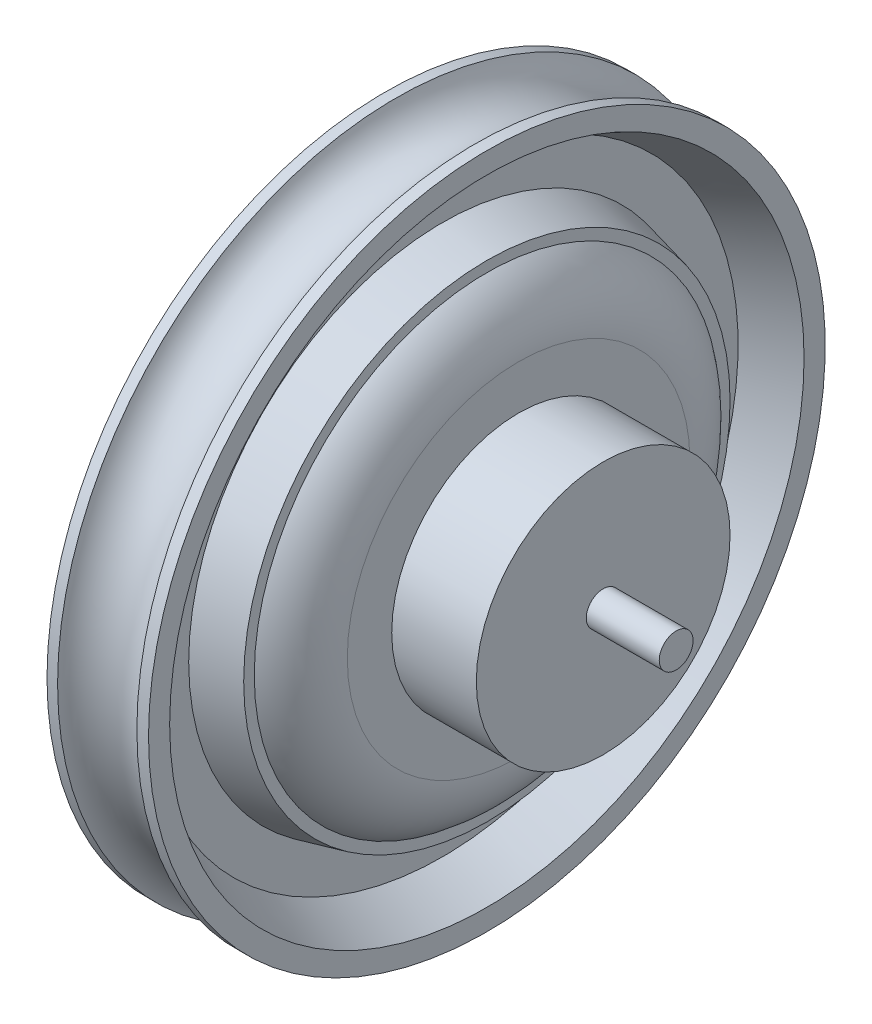
ISO-10303-21;
HEADER;
FILE_DESCRIPTION(('STEP AP214'),'2;1');
FILE_NAME('part.step','',(''),(''),'','','');
FILE_SCHEMA(('AUTOMOTIVE_DESIGN { 1 0 10303 214 1 1 1 1 }'));
ENDSEC;
DATA;
#1=APPLICATION_CONTEXT('core data for automotive mechanical design processes');
#2=APPLICATION_PROTOCOL_DEFINITION('international standard','automotive_design',2000,#1);
#3=PRODUCT_CONTEXT('',#1,'mechanical');
#4=PRODUCT('Part','Part','',(#3));
#5=PRODUCT_RELATED_PRODUCT_CATEGORY('part','',(#4));
#6=PRODUCT_DEFINITION_FORMATION('','',#4);
#7=PRODUCT_DEFINITION_CONTEXT('part definition',#1,'design');
#8=PRODUCT_DEFINITION('design','',#6,#7);
#9=PRODUCT_DEFINITION_SHAPE('','',#8);
#10=(LENGTH_UNIT() NAMED_UNIT(*) SI_UNIT(.MILLI.,.METRE.));
#11=(NAMED_UNIT(*) PLANE_ANGLE_UNIT() SI_UNIT($,.RADIAN.));
#12=(NAMED_UNIT(*) SI_UNIT($,.STERADIAN.) SOLID_ANGLE_UNIT());
#13=UNCERTAINTY_MEASURE_WITH_UNIT(LENGTH_MEASURE(1.E-05),#10,'distance_accuracy_value','');
#14=(GEOMETRIC_REPRESENTATION_CONTEXT(3) GLOBAL_UNCERTAINTY_ASSIGNED_CONTEXT((#13)) GLOBAL_UNIT_ASSIGNED_CONTEXT((#10,
#11,#12)) REPRESENTATION_CONTEXT('',''));
#15=CARTESIAN_POINT('',(0.,0.,0.));
#16=DIRECTION('',(0.,0.,1.));
#17=DIRECTION('',(1.,0.,0.));
#18=AXIS2_PLACEMENT_3D('',#15,#16,#17);
#19=CARTESIAN_POINT('',(-34.6658042744657,0.,-30.4980877390326));
#20=DIRECTION('',(-1.,0.,0.));
#21=DIRECTION('',(0.,0.,1.));
#22=AXIS2_PLACEMENT_3D('',#19,#20,#21);
#23=CYLINDRICAL_SURFACE('',#22,160.);
#24=CARTESIAN_POINT('',(41.1341957255343,0.,-30.4980877390326));
#25=DIRECTION('',(-1.,0.,0.));
#26=DIRECTION('',(0.,0.,1.));
#27=AXIS2_PLACEMENT_3D('',#24,#25,#26);
#28=CIRCLE('',#27,160.);
#29=CARTESIAN_POINT('',(41.1341957255343,0.,129.501912260967));
#30=VERTEX_POINT('',#29);
#31=EDGE_CURVE('E8',#30,#30,#28,.T.);
#32=ORIENTED_EDGE('',*,*,#31,.T.);
#33=EDGE_LOOP('',(#32));
#34=FACE_BOUND('',#33,.T.);
#35=CARTESIAN_POINT('',(36.1341957255343,0.,-30.4980877390326));
#36=DIRECTION('',(-1.,0.,0.));
#37=DIRECTION('',(0.,0.,1.));
#38=AXIS2_PLACEMENT_3D('',#35,#36,#37);
#39=CIRCLE('',#38,160.);
#40=CARTESIAN_POINT('',(36.1341957255343,0.,129.501912260967));
#41=VERTEX_POINT('',#40);
#42=EDGE_CURVE('E89',#41,#41,#39,.T.);
#43=ORIENTED_EDGE('',*,*,#42,.F.);
#44=EDGE_LOOP('',(#43));
#45=FACE_BOUND('',#44,.T.);
#46=ADVANCED_FACE('F13',(#34,#45),#23,.T.);
#47=CARTESIAN_POINT('',(59.8801501722441,0.,-30.4980877390326));
#48=DIRECTION('',(-1.,0.,0.));
#49=DIRECTION('',(0.,0.,1.));
#50=AXIS2_PLACEMENT_3D('',#47,#48,#49);
#51=TOROIDAL_SURFACE('',#50,166.614485433809,19.8786877251038);
#52=CARTESIAN_POINT('',(78.6261046189538,0.,-30.4980877390326));
#53=DIRECTION('',(-1.,0.,0.));
#54=DIRECTION('',(0.,0.,1.));
#55=AXIS2_PLACEMENT_3D('',#52,#53,#54);
#56=CIRCLE('',#55,160.);
#57=CARTESIAN_POINT('',(78.6261046189538,0.,129.501912260967));
#58=VERTEX_POINT('',#57);
#59=EDGE_CURVE('E19',#58,#58,#56,.T.);
#60=ORIENTED_EDGE('',*,*,#59,.T.);
#61=EDGE_LOOP('',(#60));
#62=FACE_BOUND('',#61,.T.);
#63=ORIENTED_EDGE('',*,*,#31,.F.);
#64=EDGE_LOOP('',(#63));
#65=FACE_BOUND('',#64,.T.);
#66=ADVANCED_FACE('F97',(#62,#65),#51,.F.);
#67=CARTESIAN_POINT('',(-34.6658042744657,0.,-30.4980877390326));
#68=DIRECTION('',(-1.,0.,0.));
#69=DIRECTION('',(0.,0.,1.));
#70=AXIS2_PLACEMENT_3D('',#67,#68,#69);
#71=CYLINDRICAL_SURFACE('',#70,160.);
#72=CARTESIAN_POINT('',(84.1341957255343,0.,-30.4980877390326));
#73=DIRECTION('',(-1.,0.,0.));
#74=DIRECTION('',(0.,0.,1.));
#75=AXIS2_PLACEMENT_3D('',#72,#73,#74);
#76=CIRCLE('',#75,160.);
#77=CARTESIAN_POINT('',(84.1341957255343,0.,129.501912260967));
#78=VERTEX_POINT('',#77);
#79=EDGE_CURVE('E23',#78,#78,#76,.T.);
#80=ORIENTED_EDGE('',*,*,#79,.T.);
#81=EDGE_LOOP('',(#80));
#82=FACE_BOUND('',#81,.T.);
#83=ORIENTED_EDGE('',*,*,#59,.F.);
#84=EDGE_LOOP('',(#83));
#85=FACE_BOUND('',#84,.T.);
#86=ADVANCED_FACE('F102',(#82,#85),#71,.T.);
#87=CARTESIAN_POINT('',(84.1341957255343,0.,129.501912260967));
#88=DIRECTION('',(1.,0.,0.));
#89=DIRECTION('',(0.,0.,-1.));
#90=AXIS2_PLACEMENT_3D('',#87,#88,#89);
#91=PLANE('',#90);
#92=CARTESIAN_POINT('',(84.1341957255343,0.,-30.4980877390326));
#93=DIRECTION('',(-1.,0.,0.));
#94=DIRECTION('',(0.,0.,1.));
#95=AXIS2_PLACEMENT_3D('',#92,#93,#94);
#96=CIRCLE('',#95,150.);
#97=CARTESIAN_POINT('',(84.1341957255343,0.,119.501912260967));
#98=VERTEX_POINT('',#97);
#99=EDGE_CURVE('E27',#98,#98,#96,.T.);
#100=ORIENTED_EDGE('',*,*,#99,.T.);
#101=EDGE_LOOP('',(#100));
#102=FACE_BOUND('',#101,.T.);
#103=ORIENTED_EDGE('',*,*,#79,.F.);
#104=EDGE_LOOP('',(#103));
#105=FACE_BOUND('',#104,.T.);
#106=ADVANCED_FACE('F106',(#102,#105),#91,.T.);
#107=CARTESIAN_POINT('',(84.1341957255343,0.,-30.4980877390326));
#108=DIRECTION('',(1.,0.,0.));
#109=DIRECTION('',(0.,0.,-1.));
#110=AXIS2_PLACEMENT_3D('',#107,#108,#109);
#111=CONICAL_SURFACE('',#110,150.,0.451502029192342);
#112=CARTESIAN_POINT('',(63.1341957255343,0.,-30.4980877390326));
#113=DIRECTION('',(-1.,0.,0.));
#114=DIRECTION('',(0.,0.,1.));
#115=AXIS2_PLACEMENT_3D('',#112,#113,#114);
#116=CIRCLE('',#115,139.816912510161);
#117=CARTESIAN_POINT('',(63.1341957255343,0.,109.318824771128));
#118=VERTEX_POINT('',#117);
#119=EDGE_CURVE('E32',#118,#118,#116,.T.);
#120=ORIENTED_EDGE('',*,*,#119,.T.);
#121=EDGE_LOOP('',(#120));
#122=FACE_BOUND('',#121,.T.);
#123=ORIENTED_EDGE('',*,*,#99,.F.);
#124=EDGE_LOOP('',(#123));
#125=FACE_BOUND('',#124,.T.);
#126=ADVANCED_FACE('F113',(#122,#125),#111,.F.);
#127=CARTESIAN_POINT('',(63.1341957255343,0.,89.5019122609674));
#128=DIRECTION('',(1.,0.,0.));
#129=DIRECTION('',(0.,0.,-1.));
#130=AXIS2_PLACEMENT_3D('',#127,#128,#129);
#131=PLANE('',#130);
#132=CARTESIAN_POINT('',(63.1341957255343,0.,-30.4980877390326));
#133=DIRECTION('',(-1.,0.,0.));
#134=DIRECTION('',(0.,0.,1.));
#135=AXIS2_PLACEMENT_3D('',#132,#133,#134);
#136=CIRCLE('',#135,120.);
#137=CARTESIAN_POINT('',(63.1341957255343,0.,89.5019122609674));
#138=VERTEX_POINT('',#137);
#139=EDGE_CURVE('E35',#138,#138,#136,.T.);
#140=ORIENTED_EDGE('',*,*,#139,.T.);
#141=EDGE_LOOP('',(#140));
#142=FACE_BOUND('',#141,.T.);
#143=ORIENTED_EDGE('',*,*,#119,.F.);
#144=EDGE_LOOP('',(#143));
#145=FACE_BOUND('',#144,.T.);
#146=ADVANCED_FACE('F117',(#142,#145),#131,.T.);
#147=CARTESIAN_POINT('',(63.1341957255343,0.,-30.4980877390326));
#148=DIRECTION('',(-1.,0.,0.));
#149=DIRECTION('',(0.,0.,1.));
#150=AXIS2_PLACEMENT_3D('',#147,#148,#149);
#151=CONICAL_SURFACE('',#150,120.,0.233743180868901);
#152=CARTESIAN_POINT('',(84.1341957255343,0.,-30.4980877390326));
#153=DIRECTION('',(-1.,0.,0.));
#154=DIRECTION('',(0.,0.,1.));
#155=AXIS2_PLACEMENT_3D('',#152,#153,#154);
#156=CIRCLE('',#155,115.);
#157=CARTESIAN_POINT('',(84.1341957255343,0.,84.5019122609674));
#158=VERTEX_POINT('',#157);
#159=EDGE_CURVE('E38',#158,#158,#156,.T.);
#160=ORIENTED_EDGE('',*,*,#159,.T.);
#161=EDGE_LOOP('',(#160));
#162=FACE_BOUND('',#161,.T.);
#163=ORIENTED_EDGE('',*,*,#139,.F.);
#164=EDGE_LOOP('',(#163));
#165=FACE_BOUND('',#164,.T.);
#166=ADVANCED_FACE('F121',(#162,#165),#151,.T.);
#167=CARTESIAN_POINT('',(84.1341957255343,0.,84.5019122609674));
#168=DIRECTION('',(1.,0.,0.));
#169=DIRECTION('',(0.,0.,-1.));
#170=AXIS2_PLACEMENT_3D('',#167,#168,#169);
#171=PLANE('',#170);
#172=CARTESIAN_POINT('',(84.1341957255343,0.,-30.4980877390326));
#173=DIRECTION('',(-1.,0.,0.));
#174=DIRECTION('',(0.,0.,1.));
#175=AXIS2_PLACEMENT_3D('',#172,#173,#174);
#176=CIRCLE('',#175,110.);
#177=CARTESIAN_POINT('',(84.1341957255343,0.,79.5019122609674));
#178=VERTEX_POINT('',#177);
#179=EDGE_CURVE('E41',#178,#178,#176,.T.);
#180=ORIENTED_EDGE('',*,*,#179,.T.);
#181=EDGE_LOOP('',(#180));
#182=FACE_BOUND('',#181,.T.);
#183=ORIENTED_EDGE('',*,*,#159,.F.);
#184=EDGE_LOOP('',(#183));
#185=FACE_BOUND('',#184,.T.);
#186=ADVANCED_FACE('F125',(#182,#185),#171,.T.);
#187=CARTESIAN_POINT('',(63.6008623922011,0.,-30.4980877390326));
#188=DIRECTION('',(-1.,0.,0.));
#189=DIRECTION('',(0.,0.,1.));
#190=AXIS2_PLACEMENT_3D('',#187,#188,#189);
#191=TOROIDAL_SURFACE('',#190,81.,35.5333333333333);
#192=CARTESIAN_POINT('',(99.1341957255343,0.,-30.4980877390326));
#193=DIRECTION('',(-1.,0.,0.));
#194=DIRECTION('',(0.,0.,1.));
#195=AXIS2_PLACEMENT_3D('',#192,#193,#194);
#196=CIRCLE('',#195,81.);
#197=CARTESIAN_POINT('',(99.1341957255343,0.,50.5019122609674));
#198=VERTEX_POINT('',#197);
#199=EDGE_CURVE('E44',#198,#198,#196,.T.);
#200=ORIENTED_EDGE('',*,*,#199,.T.);
#201=EDGE_LOOP('',(#200));
#202=FACE_BOUND('',#201,.T.);
#203=ORIENTED_EDGE('',*,*,#179,.F.);
#204=EDGE_LOOP('',(#203));
#205=FACE_BOUND('',#204,.T.);
#206=ADVANCED_FACE('F129',(#202,#205),#191,.T.);
#207=CARTESIAN_POINT('',(99.1341957255343,0.,29.5019122609674));
#208=DIRECTION('',(1.,0.,0.));
#209=DIRECTION('',(0.,0.,-1.));
#210=AXIS2_PLACEMENT_3D('',#207,#208,#209);
#211=PLANE('',#210);
#212=CARTESIAN_POINT('',(99.1341957255343,0.,-30.4980877390326));
#213=DIRECTION('',(-1.,0.,0.));
#214=DIRECTION('',(0.,0.,1.));
#215=AXIS2_PLACEMENT_3D('',#212,#213,#214);
#216=CIRCLE('',#215,60.);
#217=CARTESIAN_POINT('',(99.1341957255343,0.,29.5019122609674));
#218=VERTEX_POINT('',#217);
#219=EDGE_CURVE('E47',#218,#218,#216,.T.);
#220=ORIENTED_EDGE('',*,*,#219,.T.);
#221=EDGE_LOOP('',(#220));
#222=FACE_BOUND('',#221,.T.);
#223=ORIENTED_EDGE('',*,*,#199,.F.);
#224=EDGE_LOOP('',(#223));
#225=FACE_BOUND('',#224,.T.);
#226=ADVANCED_FACE('F133',(#222,#225),#211,.T.);
#227=CARTESIAN_POINT('',(-34.6658042744657,0.,-30.4980877390326));
#228=DIRECTION('',(-1.,0.,0.));
#229=DIRECTION('',(0.,0.,1.));
#230=AXIS2_PLACEMENT_3D('',#227,#228,#229);
#231=CYLINDRICAL_SURFACE('',#230,60.);
#232=CARTESIAN_POINT('',(139.134195725534,0.,-30.4980877390326));
#233=DIRECTION('',(-1.,0.,0.));
#234=DIRECTION('',(0.,0.,1.));
#235=AXIS2_PLACEMENT_3D('',#232,#233,#234);
#236=CIRCLE('',#235,60.);
#237=CARTESIAN_POINT('',(139.134195725534,0.,29.5019122609674));
#238=VERTEX_POINT('',#237);
#239=EDGE_CURVE('E50',#238,#238,#236,.T.);
#240=ORIENTED_EDGE('',*,*,#239,.T.);
#241=EDGE_LOOP('',(#240));
#242=FACE_BOUND('',#241,.T.);
#243=ORIENTED_EDGE('',*,*,#219,.F.);
#244=EDGE_LOOP('',(#243));
#245=FACE_BOUND('',#244,.T.);
#246=ADVANCED_FACE('F137',(#242,#245),#231,.T.);
#247=CARTESIAN_POINT('',(139.134195725534,0.,29.5019122609674));
#248=DIRECTION('',(1.,0.,0.));
#249=DIRECTION('',(0.,0.,-1.));
#250=AXIS2_PLACEMENT_3D('',#247,#248,#249);
#251=PLANE('',#250);
#252=CARTESIAN_POINT('',(139.134195725534,0.,-30.4980877390326));
#253=DIRECTION('',(-1.,0.,0.));
#254=DIRECTION('',(0.,0.,1.));
#255=AXIS2_PLACEMENT_3D('',#252,#253,#254);
#256=CIRCLE('',#255,8.00000000000001);
#257=CARTESIAN_POINT('',(139.134195725534,0.,-22.4980877390326));
#258=VERTEX_POINT('',#257);
#259=EDGE_CURVE('E53',#258,#258,#256,.T.);
#260=ORIENTED_EDGE('',*,*,#259,.T.);
#261=EDGE_LOOP('',(#260));
#262=FACE_BOUND('',#261,.T.);
#263=ORIENTED_EDGE('',*,*,#239,.F.);
#264=EDGE_LOOP('',(#263));
#265=FACE_BOUND('',#264,.T.);
#266=ADVANCED_FACE('F141',(#262,#265),#251,.T.);
#267=CARTESIAN_POINT('',(-34.6658042744657,0.,-30.4980877390326));
#268=DIRECTION('',(-1.,0.,0.));
#269=DIRECTION('',(0.,0.,1.));
#270=AXIS2_PLACEMENT_3D('',#267,#268,#269);
#271=CYLINDRICAL_SURFACE('',#270,8.);
#272=CARTESIAN_POINT('',(173.634195725534,0.,-30.4980877390326));
#273=DIRECTION('',(-1.,0.,0.));
#274=DIRECTION('',(0.,0.,1.));
#275=AXIS2_PLACEMENT_3D('',#272,#273,#274);
#276=CIRCLE('',#275,8.);
#277=CARTESIAN_POINT('',(173.634195725534,0.,-22.4980877390326));
#278=VERTEX_POINT('',#277);
#279=EDGE_CURVE('E56',#278,#278,#276,.T.);
#280=ORIENTED_EDGE('',*,*,#279,.T.);
#281=EDGE_LOOP('',(#280));
#282=FACE_BOUND('',#281,.T.);
#283=ORIENTED_EDGE('',*,*,#259,.F.);
#284=EDGE_LOOP('',(#283));
#285=FACE_BOUND('',#284,.T.);
#286=ADVANCED_FACE('F145',(#282,#285),#271,.T.);
#287=CARTESIAN_POINT('',(173.634195725534,0.,-30.4980877390326));
#288=DIRECTION('',(1.,0.,0.));
#289=DIRECTION('',(0.,0.,-1.));
#290=AXIS2_PLACEMENT_3D('',#287,#288,#289);
#291=PLANE('',#290);
#292=ORIENTED_EDGE('',*,*,#279,.F.);
#293=EDGE_LOOP('',(#292));
#294=FACE_BOUND('',#293,.T.);
#295=ADVANCED_FACE('F149',(#294),#291,.T.);
#296=CARTESIAN_POINT('',(-53.3658042744657,0.,-30.4980877390326));
#297=DIRECTION('',(-1.,0.,0.));
#298=DIRECTION('',(0.,0.,1.));
#299=AXIS2_PLACEMENT_3D('',#296,#297,#298);
#300=PLANE('',#299);
#301=CARTESIAN_POINT('',(-53.3658042744657,0.,-30.4980877390326));
#302=DIRECTION('',(-1.,0.,0.));
#303=DIRECTION('',(0.,0.,1.));
#304=AXIS2_PLACEMENT_3D('',#301,#302,#303);
#305=CIRCLE('',#304,8.);
#306=CARTESIAN_POINT('',(-53.3658042744657,0.,-22.4980877390326));
#307=VERTEX_POINT('',#306);
#308=EDGE_CURVE('E59',#307,#307,#305,.T.);
#309=ORIENTED_EDGE('',*,*,#308,.T.);
#310=EDGE_LOOP('',(#309));
#311=FACE_BOUND('',#310,.T.);
#312=ADVANCED_FACE('F153',(#311),#300,.T.);
#313=CARTESIAN_POINT('',(-34.6658042744657,0.,-30.4980877390326));
#314=DIRECTION('',(-1.,0.,0.));
#315=DIRECTION('',(0.,0.,1.));
#316=AXIS2_PLACEMENT_3D('',#313,#314,#315);
#317=CYLINDRICAL_SURFACE('',#316,8.);
#318=CARTESIAN_POINT('',(-18.8658042744657,0.,-30.4980877390326));
#319=DIRECTION('',(-1.,0.,0.));
#320=DIRECTION('',(0.,0.,1.));
#321=AXIS2_PLACEMENT_3D('',#318,#319,#320);
#322=CIRCLE('',#321,8.);
#323=CARTESIAN_POINT('',(-18.8658042744657,0.,-22.4980877390326));
#324=VERTEX_POINT('',#323);
#325=EDGE_CURVE('E62',#324,#324,#322,.T.);
#326=ORIENTED_EDGE('',*,*,#325,.T.);
#327=EDGE_LOOP('',(#326));
#328=FACE_BOUND('',#327,.T.);
#329=ORIENTED_EDGE('',*,*,#308,.F.);
#330=EDGE_LOOP('',(#329));
#331=FACE_BOUND('',#330,.T.);
#332=ADVANCED_FACE('F157',(#328,#331),#317,.T.);
#333=CARTESIAN_POINT('',(-18.8658042744657,0.,-22.4980877390326));
#334=DIRECTION('',(-1.,0.,0.));
#335=DIRECTION('',(0.,0.,1.));
#336=AXIS2_PLACEMENT_3D('',#333,#334,#335);
#337=PLANE('',#336);
#338=CARTESIAN_POINT('',(-18.8658042744657,0.,-30.4980877390326));
#339=DIRECTION('',(-1.,0.,0.));
#340=DIRECTION('',(0.,0.,1.));
#341=AXIS2_PLACEMENT_3D('',#338,#339,#340);
#342=CIRCLE('',#341,20.);
#343=CARTESIAN_POINT('',(-18.8658042744657,0.,-10.4980877390326));
#344=VERTEX_POINT('',#343);
#345=EDGE_CURVE('E65',#344,#344,#342,.T.);
#346=ORIENTED_EDGE('',*,*,#345,.T.);
#347=EDGE_LOOP('',(#346));
#348=FACE_BOUND('',#347,.T.);
#349=ORIENTED_EDGE('',*,*,#325,.F.);
#350=EDGE_LOOP('',(#349));
#351=FACE_BOUND('',#350,.T.);
#352=ADVANCED_FACE('F161',(#348,#351),#337,.T.);
#353=CARTESIAN_POINT('',(-34.6658042744657,0.,-30.4980877390326));
#354=DIRECTION('',(-1.,0.,0.));
#355=DIRECTION('',(0.,0.,1.));
#356=AXIS2_PLACEMENT_3D('',#353,#354,#355);
#357=CYLINDRICAL_SURFACE('',#356,20.);
#358=CARTESIAN_POINT('',(21.1341957255343,0.,-30.4980877390326));
#359=DIRECTION('',(-1.,0.,0.));
#360=DIRECTION('',(0.,0.,1.));
#361=AXIS2_PLACEMENT_3D('',#358,#359,#360);
#362=CIRCLE('',#361,20.);
#363=CARTESIAN_POINT('',(21.1341957255343,0.,-10.4980877390326));
#364=VERTEX_POINT('',#363);
#365=EDGE_CURVE('E68',#364,#364,#362,.T.);
#366=ORIENTED_EDGE('',*,*,#365,.T.);
#367=EDGE_LOOP('',(#366));
#368=FACE_BOUND('',#367,.T.);
#369=ORIENTED_EDGE('',*,*,#345,.F.);
#370=EDGE_LOOP('',(#369));
#371=FACE_BOUND('',#370,.T.);
#372=ADVANCED_FACE('F165',(#368,#371),#357,.T.);
#373=CARTESIAN_POINT('',(21.1341957255343,0.,-10.4980877390326));
#374=DIRECTION('',(-1.,0.,0.));
#375=DIRECTION('',(0.,0.,1.));
#376=AXIS2_PLACEMENT_3D('',#373,#374,#375);
#377=PLANE('',#376);
#378=CARTESIAN_POINT('',(21.1341957255343,0.,-30.4980877390326));
#379=DIRECTION('',(-1.,0.,0.));
#380=DIRECTION('',(0.,0.,1.));
#381=AXIS2_PLACEMENT_3D('',#378,#379,#380);
#382=CIRCLE('',#381,81.);
#383=CARTESIAN_POINT('',(21.1341957255343,0.,50.5019122609674));
#384=VERTEX_POINT('',#383);
#385=EDGE_CURVE('E71',#384,#384,#382,.T.);
#386=ORIENTED_EDGE('',*,*,#385,.T.);
#387=EDGE_LOOP('',(#386));
#388=FACE_BOUND('',#387,.T.);
#389=ORIENTED_EDGE('',*,*,#365,.F.);
#390=EDGE_LOOP('',(#389));
#391=FACE_BOUND('',#390,.T.);
#392=ADVANCED_FACE('F169',(#388,#391),#377,.T.);
#393=CARTESIAN_POINT('',(56.6675290588677,0.,-30.4980877390326));
#394=DIRECTION('',(-1.,0.,0.));
#395=DIRECTION('',(0.,0.,1.));
#396=AXIS2_PLACEMENT_3D('',#393,#394,#395);
#397=TOROIDAL_SURFACE('',#396,81.,35.5333333333333);
#398=CARTESIAN_POINT('',(36.1341957255343,0.,-30.4980877390326));
#399=DIRECTION('',(-1.,0.,0.));
#400=DIRECTION('',(0.,0.,1.));
#401=AXIS2_PLACEMENT_3D('',#398,#399,#400);
#402=CIRCLE('',#401,110.);
#403=CARTESIAN_POINT('',(36.1341957255343,0.,79.5019122609674));
#404=VERTEX_POINT('',#403);
#405=EDGE_CURVE('E74',#404,#404,#402,.T.);
#406=ORIENTED_EDGE('',*,*,#405,.T.);
#407=EDGE_LOOP('',(#406));
#408=FACE_BOUND('',#407,.T.);
#409=ORIENTED_EDGE('',*,*,#385,.F.);
#410=EDGE_LOOP('',(#409));
#411=FACE_BOUND('',#410,.T.);
#412=ADVANCED_FACE('F173',(#408,#411),#397,.T.);
#413=CARTESIAN_POINT('',(36.1341957255343,0.,84.5019122609674));
#414=DIRECTION('',(-1.,0.,0.));
#415=DIRECTION('',(0.,0.,1.));
#416=AXIS2_PLACEMENT_3D('',#413,#414,#415);
#417=PLANE('',#416);
#418=CARTESIAN_POINT('',(36.1341957255343,0.,-30.4980877390326));
#419=DIRECTION('',(-1.,0.,0.));
#420=DIRECTION('',(0.,0.,1.));
#421=AXIS2_PLACEMENT_3D('',#418,#419,#420);
#422=CIRCLE('',#421,115.);
#423=CARTESIAN_POINT('',(36.1341957255343,0.,84.5019122609674));
#424=VERTEX_POINT('',#423);
#425=EDGE_CURVE('E77',#424,#424,#422,.T.);
#426=ORIENTED_EDGE('',*,*,#425,.T.);
#427=EDGE_LOOP('',(#426));
#428=FACE_BOUND('',#427,.T.);
#429=ORIENTED_EDGE('',*,*,#405,.F.);
#430=EDGE_LOOP('',(#429));
#431=FACE_BOUND('',#430,.T.);
#432=ADVANCED_FACE('F177',(#428,#431),#417,.T.);
#433=CARTESIAN_POINT('',(36.1341957255343,0.,-30.4980877390326));
#434=DIRECTION('',(1.,0.,0.));
#435=DIRECTION('',(0.,0.,-1.));
#436=AXIS2_PLACEMENT_3D('',#433,#434,#435);
#437=CONICAL_SURFACE('',#436,115.,0.233743180868902);
#438=CARTESIAN_POINT('',(57.1341957255343,0.,-30.4980877390326));
#439=DIRECTION('',(-1.,0.,0.));
#440=DIRECTION('',(0.,0.,1.));
#441=AXIS2_PLACEMENT_3D('',#438,#439,#440);
#442=CIRCLE('',#441,120.);
#443=CARTESIAN_POINT('',(57.1341957255343,0.,89.5019122609674));
#444=VERTEX_POINT('',#443);
#445=EDGE_CURVE('E80',#444,#444,#442,.T.);
#446=ORIENTED_EDGE('',*,*,#445,.T.);
#447=EDGE_LOOP('',(#446));
#448=FACE_BOUND('',#447,.T.);
#449=ORIENTED_EDGE('',*,*,#425,.F.);
#450=EDGE_LOOP('',(#449));
#451=FACE_BOUND('',#450,.T.);
#452=ADVANCED_FACE('F181',(#448,#451),#437,.T.);
#453=CARTESIAN_POINT('',(57.1341957255343,0.,89.5019122609674));
#454=DIRECTION('',(-1.,0.,0.));
#455=DIRECTION('',(0.,0.,1.));
#456=AXIS2_PLACEMENT_3D('',#453,#454,#455);
#457=PLANE('',#456);
#458=CARTESIAN_POINT('',(57.1341957255343,0.,-30.4980877390326));
#459=DIRECTION('',(-1.,0.,0.));
#460=DIRECTION('',(0.,0.,1.));
#461=AXIS2_PLACEMENT_3D('',#458,#459,#460);
#462=CIRCLE('',#461,139.816912510161);
#463=CARTESIAN_POINT('',(57.1341957255343,0.,109.318824771128));
#464=VERTEX_POINT('',#463);
#465=EDGE_CURVE('E83',#464,#464,#462,.T.);
#466=ORIENTED_EDGE('',*,*,#465,.T.);
#467=EDGE_LOOP('',(#466));
#468=FACE_BOUND('',#467,.T.);
#469=ORIENTED_EDGE('',*,*,#445,.F.);
#470=EDGE_LOOP('',(#469));
#471=FACE_BOUND('',#470,.T.);
#472=ADVANCED_FACE('F185',(#468,#471),#457,.T.);
#473=CARTESIAN_POINT('',(57.1341957255343,0.,-30.4980877390326));
#474=DIRECTION('',(-1.,0.,0.));
#475=DIRECTION('',(0.,0.,1.));
#476=AXIS2_PLACEMENT_3D('',#473,#474,#475);
#477=CONICAL_SURFACE('',#476,139.816912510161,0.451502029192342);
#478=CARTESIAN_POINT('',(36.1341957255343,0.,-30.4980877390326));
#479=DIRECTION('',(-1.,0.,0.));
#480=DIRECTION('',(0.,0.,1.));
#481=AXIS2_PLACEMENT_3D('',#478,#479,#480);
#482=CIRCLE('',#481,150.);
#483=CARTESIAN_POINT('',(36.1341957255343,0.,119.501912260967));
#484=VERTEX_POINT('',#483);
#485=EDGE_CURVE('E86',#484,#484,#482,.T.);
#486=ORIENTED_EDGE('',*,*,#485,.T.);
#487=EDGE_LOOP('',(#486));
#488=FACE_BOUND('',#487,.T.);
#489=ORIENTED_EDGE('',*,*,#465,.F.);
#490=EDGE_LOOP('',(#489));
#491=FACE_BOUND('',#490,.T.);
#492=ADVANCED_FACE('F189',(#488,#491),#477,.F.);
#493=CARTESIAN_POINT('',(36.1341957255343,0.,129.501912260967));
#494=DIRECTION('',(-1.,0.,0.));
#495=DIRECTION('',(0.,0.,1.));
#496=AXIS2_PLACEMENT_3D('',#493,#494,#495);
#497=PLANE('',#496);
#498=ORIENTED_EDGE('',*,*,#42,.T.);
#499=EDGE_LOOP('',(#498));
#500=FACE_BOUND('',#499,.T.);
#501=ORIENTED_EDGE('',*,*,#485,.F.);
#502=EDGE_LOOP('',(#501));
#503=FACE_BOUND('',#502,.T.);
#504=ADVANCED_FACE('F93',(#500,#503),#497,.T.);
#505=CLOSED_SHELL('',(#46,#66,#86,#106,#126,#146,#166,#186,#206,#226,#246,#266,#286,#295,#312,
#332,#352,#372,#392,#412,#432,#452,#472,#492,#504));
#506=MANIFOLD_SOLID_BREP('B1',#505);
#507=ADVANCED_BREP_SHAPE_REPRESENTATION('',(#18,#506),#14);
#508=SHAPE_DEFINITION_REPRESENTATION(#9,#507);
ENDSEC;
END-ISO-10303-21;
